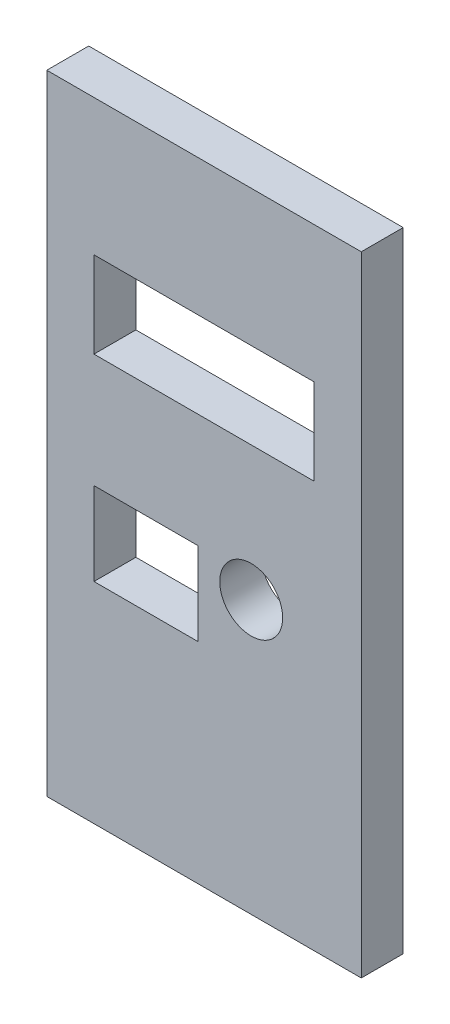
ISO-10303-21;
HEADER;
FILE_DESCRIPTION(('STEP AP214'),'2;1');
FILE_NAME('part.step','',(''),(''),'','','');
FILE_SCHEMA(('AUTOMOTIVE_DESIGN { 1 0 10303 214 1 1 1 1 }'));
ENDSEC;
DATA;
#1=APPLICATION_CONTEXT('core data for automotive mechanical design processes');
#2=APPLICATION_PROTOCOL_DEFINITION('international standard','automotive_design',2000,#1);
#3=PRODUCT_CONTEXT('',#1,'mechanical');
#4=PRODUCT('Part','Part','',(#3));
#5=PRODUCT_RELATED_PRODUCT_CATEGORY('part','',(#4));
#6=PRODUCT_DEFINITION_FORMATION('','',#4);
#7=PRODUCT_DEFINITION_CONTEXT('part definition',#1,'design');
#8=PRODUCT_DEFINITION('design','',#6,#7);
#9=PRODUCT_DEFINITION_SHAPE('','',#8);
#10=(LENGTH_UNIT() NAMED_UNIT(*) SI_UNIT(.MILLI.,.METRE.));
#11=(NAMED_UNIT(*) PLANE_ANGLE_UNIT() SI_UNIT($,.RADIAN.));
#12=(NAMED_UNIT(*) SI_UNIT($,.STERADIAN.) SOLID_ANGLE_UNIT());
#13=UNCERTAINTY_MEASURE_WITH_UNIT(LENGTH_MEASURE(1.E-05),#10,'distance_accuracy_value','');
#14=(GEOMETRIC_REPRESENTATION_CONTEXT(3) GLOBAL_UNCERTAINTY_ASSIGNED_CONTEXT((#13)) GLOBAL_UNIT_ASSIGNED_CONTEXT((#10,
#11,#12)) REPRESENTATION_CONTEXT('',''));
#15=CARTESIAN_POINT('',(0.,0.,0.));
#16=DIRECTION('',(0.,0.,1.));
#17=DIRECTION('',(1.,0.,0.));
#18=AXIS2_PLACEMENT_3D('',#15,#16,#17);
#19=CARTESIAN_POINT('',(0.,0.,2.));
#20=DIRECTION('',(0.,0.,1.));
#21=DIRECTION('',(1.,0.,0.));
#22=AXIS2_PLACEMENT_3D('',#19,#20,#21);
#23=PLANE('',#22);
#24=CARTESIAN_POINT('',(2.25,-2.,2.));
#25=DIRECTION('',(0.,0.,1.));
#26=DIRECTION('',(1.,0.,0.));
#27=AXIS2_PLACEMENT_3D('',#24,#25,#26);
#28=CIRCLE('',#27,1.5);
#29=CARTESIAN_POINT('',(3.75,-2.,2.));
#30=VERTEX_POINT('',#29);
#31=EDGE_CURVE('E223',#30,#30,#28,.T.);
#32=ORIENTED_EDGE('',*,*,#31,.F.);
#33=EDGE_LOOP('',(#32));
#34=FACE_BOUND('',#33,.T.);
#35=DIRECTION('',(0.,1.,0.));
#36=VECTOR('',#35,1.);
#37=CARTESIAN_POINT('',(-0.296198575968552,0.,2.));
#38=LINE('',#37,#36);
#39=CARTESIAN_POINT('',(-0.296198575968552,-4.99598046327325,2.));
#40=VERTEX_POINT('',#39);
#41=CARTESIAN_POINT('',(-0.296198575968552,-1.03441005186715,2.));
#42=VERTEX_POINT('',#41);
#43=EDGE_CURVE('E49',#40,#42,#38,.T.);
#44=ORIENTED_EDGE('',*,*,#43,.F.);
#45=DIRECTION('',(-1.,0.,0.));
#46=VECTOR('',#45,1.);
#47=CARTESIAN_POINT('',(0.,-4.99598046327325,2.));
#48=LINE('',#47,#46);
#49=CARTESIAN_POINT('',(-5.25,-4.99598046327325,2.));
#50=VERTEX_POINT('',#49);
#51=EDGE_CURVE('E141',#40,#50,#48,.T.);
#52=ORIENTED_EDGE('',*,*,#51,.T.);
#53=DIRECTION('',(0.,1.,0.));
#54=VECTOR('',#53,1.);
#55=CARTESIAN_POINT('',(-5.25,0.,2.));
#56=LINE('',#55,#54);
#57=CARTESIAN_POINT('',(-5.25,-1.03441005186715,2.));
#58=VERTEX_POINT('',#57);
#59=EDGE_CURVE('E126',#50,#58,#56,.T.);
#60=ORIENTED_EDGE('',*,*,#59,.T.);
#61=DIRECTION('',(-1.,0.,0.));
#62=VECTOR('',#61,1.);
#63=CARTESIAN_POINT('',(0.,-1.03441005186715,2.));
#64=LINE('',#63,#62);
#65=EDGE_CURVE('E135',#42,#58,#64,.T.);
#66=ORIENTED_EDGE('',*,*,#65,.F.);
#67=EDGE_LOOP('',(#44,#52,#60,#66));
#68=FACE_BOUND('',#67,.T.);
#69=DIRECTION('',(0.,-1.,0.));
#70=VECTOR('',#69,1.);
#71=CARTESIAN_POINT('',(-7.5,-15.,2.));
#72=LINE('',#71,#70);
#73=CARTESIAN_POINT('',(-7.5,15.,2.));
#74=VERTEX_POINT('',#73);
#75=CARTESIAN_POINT('',(-7.5,-15.,2.));
#76=VERTEX_POINT('',#75);
#77=EDGE_CURVE('E172',#74,#76,#72,.T.);
#78=ORIENTED_EDGE('',*,*,#77,.T.);
#79=DIRECTION('',(1.,0.,0.));
#80=VECTOR('',#79,1.);
#81=CARTESIAN_POINT('',(7.5,-15.,2.));
#82=LINE('',#81,#80);
#83=CARTESIAN_POINT('',(7.5,-15.,2.));
#84=VERTEX_POINT('',#83);
#85=EDGE_CURVE('E175',#76,#84,#82,.T.);
#86=ORIENTED_EDGE('',*,*,#85,.T.);
#87=DIRECTION('',(0.,1.,0.));
#88=VECTOR('',#87,1.);
#89=CARTESIAN_POINT('',(7.5,-15.,2.));
#90=LINE('',#89,#88);
#91=CARTESIAN_POINT('',(7.5,15.,2.));
#92=VERTEX_POINT('',#91);
#93=EDGE_CURVE('E178',#84,#92,#90,.T.);
#94=ORIENTED_EDGE('',*,*,#93,.T.);
#95=DIRECTION('',(-1.,0.,0.));
#96=VECTOR('',#95,1.);
#97=CARTESIAN_POINT('',(7.5,15.,2.));
#98=LINE('',#97,#96);
#99=EDGE_CURVE('E180',#92,#74,#98,.T.);
#100=ORIENTED_EDGE('',*,*,#99,.T.);
#101=EDGE_LOOP('',(#78,#86,#94,#100));
#102=FACE_BOUND('',#101,.T.);
#103=DIRECTION('',(0.,1.,0.));
#104=VECTOR('',#103,1.);
#105=CARTESIAN_POINT('',(5.25,0.,2.));
#106=LINE('',#105,#104);
#107=CARTESIAN_POINT('',(5.25,4.39711256157767,2.));
#108=VERTEX_POINT('',#107);
#109=CARTESIAN_POINT('',(5.25,8.5,2.));
#110=VERTEX_POINT('',#109);
#111=EDGE_CURVE('E153',#108,#110,#106,.T.);
#112=ORIENTED_EDGE('',*,*,#111,.F.);
#113=DIRECTION('',(-1.,0.,0.));
#114=VECTOR('',#113,1.);
#115=CARTESIAN_POINT('',(0.,4.39711256157767,2.));
#116=LINE('',#115,#114);
#117=CARTESIAN_POINT('',(-5.25,4.39711256157767,2.));
#118=VERTEX_POINT('',#117);
#119=EDGE_CURVE('E148',#108,#118,#116,.T.);
#120=ORIENTED_EDGE('',*,*,#119,.T.);
#121=DIRECTION('',(0.,1.,0.));
#122=VECTOR('',#121,1.);
#123=CARTESIAN_POINT('',(-5.25,0.,2.));
#124=LINE('',#123,#122);
#125=CARTESIAN_POINT('',(-5.25,8.5,2.));
#126=VERTEX_POINT('',#125);
#127=EDGE_CURVE('E159',#118,#126,#124,.T.);
#128=ORIENTED_EDGE('',*,*,#127,.T.);
#129=DIRECTION('',(-1.,0.,0.));
#130=VECTOR('',#129,1.);
#131=CARTESIAN_POINT('',(0.,8.5,2.));
#132=LINE('',#131,#130);
#133=EDGE_CURVE('E156',#110,#126,#132,.T.);
#134=ORIENTED_EDGE('',*,*,#133,.F.);
#135=EDGE_LOOP('',(#112,#120,#128,#134));
#136=FACE_BOUND('',#135,.T.);
#137=ADVANCED_FACE('F33',(#34,#68,#102,#136),#23,.T.);
#138=CARTESIAN_POINT('',(0.,0.,0.));
#139=DIRECTION('',(0.,0.,1.));
#140=DIRECTION('',(1.,0.,0.));
#141=AXIS2_PLACEMENT_3D('',#138,#139,#140);
#142=PLANE('',#141);
#143=CARTESIAN_POINT('',(2.25,-2.,0.));
#144=DIRECTION('',(0.,0.,1.));
#145=DIRECTION('',(1.,0.,0.));
#146=AXIS2_PLACEMENT_3D('',#143,#144,#145);
#147=CIRCLE('',#146,1.5);
#148=CARTESIAN_POINT('',(3.75,-2.,0.));
#149=VERTEX_POINT('',#148);
#150=EDGE_CURVE('E37',#149,#149,#147,.T.);
#151=ORIENTED_EDGE('',*,*,#150,.T.);
#152=EDGE_LOOP('',(#151));
#153=FACE_BOUND('',#152,.T.);
#154=DIRECTION('',(-1.,0.,0.));
#155=VECTOR('',#154,1.);
#156=CARTESIAN_POINT('',(0.,-4.99598046327325,0.));
#157=LINE('',#156,#155);
#158=CARTESIAN_POINT('',(-0.296198575968552,-4.99598046327325,0.));
#159=VERTEX_POINT('',#158);
#160=CARTESIAN_POINT('',(-5.25,-4.99598046327325,0.));
#161=VERTEX_POINT('',#160);
#162=EDGE_CURVE('E42',#159,#161,#157,.T.);
#163=ORIENTED_EDGE('',*,*,#162,.F.);
#164=DIRECTION('',(0.,1.,0.));
#165=VECTOR('',#164,1.);
#166=CARTESIAN_POINT('',(-0.296198575968552,0.,0.));
#167=LINE('',#166,#165);
#168=CARTESIAN_POINT('',(-0.296198575968552,-1.03441005186715,0.));
#169=VERTEX_POINT('',#168);
#170=EDGE_CURVE('E11',#159,#169,#167,.T.);
#171=ORIENTED_EDGE('',*,*,#170,.T.);
#172=DIRECTION('',(-1.,0.,0.));
#173=VECTOR('',#172,1.);
#174=CARTESIAN_POINT('',(0.,-1.03441005186715,0.));
#175=LINE('',#174,#173);
#176=CARTESIAN_POINT('',(-5.25,-1.03441005186715,0.));
#177=VERTEX_POINT('',#176);
#178=EDGE_CURVE('E211',#169,#177,#175,.T.);
#179=ORIENTED_EDGE('',*,*,#178,.T.);
#180=DIRECTION('',(0.,1.,0.));
#181=VECTOR('',#180,1.);
#182=CARTESIAN_POINT('',(-5.25,0.,0.));
#183=LINE('',#182,#181);
#184=EDGE_CURVE('E129',#161,#177,#183,.T.);
#185=ORIENTED_EDGE('',*,*,#184,.F.);
#186=EDGE_LOOP('',(#163,#171,#179,#185));
#187=FACE_BOUND('',#186,.T.);
#188=DIRECTION('',(0.,-1.,0.));
#189=VECTOR('',#188,1.);
#190=CARTESIAN_POINT('',(-7.5,-15.,0.));
#191=LINE('',#190,#189);
#192=CARTESIAN_POINT('',(-7.5,15.,0.));
#193=VERTEX_POINT('',#192);
#194=CARTESIAN_POINT('',(-7.5,-15.,0.));
#195=VERTEX_POINT('',#194);
#196=EDGE_CURVE('E165',#193,#195,#191,.T.);
#197=ORIENTED_EDGE('',*,*,#196,.F.);
#198=DIRECTION('',(-1.,0.,0.));
#199=VECTOR('',#198,1.);
#200=CARTESIAN_POINT('',(7.5,15.,0.));
#201=LINE('',#200,#199);
#202=CARTESIAN_POINT('',(7.5,15.,0.));
#203=VERTEX_POINT('',#202);
#204=EDGE_CURVE('E176',#203,#193,#201,.T.);
#205=ORIENTED_EDGE('',*,*,#204,.F.);
#206=DIRECTION('',(0.,1.,0.));
#207=VECTOR('',#206,1.);
#208=CARTESIAN_POINT('',(7.5,-15.,0.));
#209=LINE('',#208,#207);
#210=CARTESIAN_POINT('',(7.5,-15.,0.));
#211=VERTEX_POINT('',#210);
#212=EDGE_CURVE('E187',#211,#203,#209,.T.);
#213=ORIENTED_EDGE('',*,*,#212,.F.);
#214=DIRECTION('',(1.,0.,0.));
#215=VECTOR('',#214,1.);
#216=CARTESIAN_POINT('',(7.5,-15.,0.));
#217=LINE('',#216,#215);
#218=EDGE_CURVE('E185',#195,#211,#217,.T.);
#219=ORIENTED_EDGE('',*,*,#218,.F.);
#220=EDGE_LOOP('',(#197,#205,#213,#219));
#221=FACE_BOUND('',#220,.T.);
#222=DIRECTION('',(-1.,0.,0.));
#223=VECTOR('',#222,1.);
#224=CARTESIAN_POINT('',(0.,4.39711256157767,0.));
#225=LINE('',#224,#223);
#226=CARTESIAN_POINT('',(5.25,4.39711256157767,0.));
#227=VERTEX_POINT('',#226);
#228=CARTESIAN_POINT('',(-5.25,4.39711256157767,0.));
#229=VERTEX_POINT('',#228);
#230=EDGE_CURVE('E209',#227,#229,#225,.T.);
#231=ORIENTED_EDGE('',*,*,#230,.F.);
#232=DIRECTION('',(0.,1.,0.));
#233=VECTOR('',#232,1.);
#234=CARTESIAN_POINT('',(5.25,0.,0.));
#235=LINE('',#234,#233);
#236=CARTESIAN_POINT('',(5.25,8.5,0.));
#237=VERTEX_POINT('',#236);
#238=EDGE_CURVE('E201',#227,#237,#235,.T.);
#239=ORIENTED_EDGE('',*,*,#238,.T.);
#240=DIRECTION('',(-1.,0.,0.));
#241=VECTOR('',#240,1.);
#242=CARTESIAN_POINT('',(0.,8.5,0.));
#243=LINE('',#242,#241);
#244=CARTESIAN_POINT('',(-5.25,8.5,0.));
#245=VERTEX_POINT('',#244);
#246=EDGE_CURVE('E204',#237,#245,#243,.T.);
#247=ORIENTED_EDGE('',*,*,#246,.T.);
#248=DIRECTION('',(0.,1.,0.));
#249=VECTOR('',#248,1.);
#250=CARTESIAN_POINT('',(-5.25,0.,0.));
#251=LINE('',#250,#249);
#252=EDGE_CURVE('E207',#229,#245,#251,.T.);
#253=ORIENTED_EDGE('',*,*,#252,.F.);
#254=EDGE_LOOP('',(#231,#239,#247,#253));
#255=FACE_BOUND('',#254,.T.);
#256=ADVANCED_FACE('F219',(#153,#187,#221,#255),#142,.F.);
#257=CARTESIAN_POINT('',(-7.5,-15.,2.));
#258=DIRECTION('',(1.,0.,0.));
#259=DIRECTION('',(0.,1.,0.));
#260=AXIS2_PLACEMENT_3D('',#257,#258,#259);
#261=PLANE('',#260);
#262=ORIENTED_EDGE('',*,*,#196,.T.);
#263=DIRECTION('',(0.,0.,-1.));
#264=VECTOR('',#263,1.);
#265=CARTESIAN_POINT('',(-7.5,-15.,2.));
#266=LINE('',#265,#264);
#267=EDGE_CURVE('E198',#76,#195,#266,.T.);
#268=ORIENTED_EDGE('',*,*,#267,.F.);
#269=ORIENTED_EDGE('',*,*,#77,.F.);
#270=DIRECTION('',(0.,0.,-1.));
#271=VECTOR('',#270,1.);
#272=CARTESIAN_POINT('',(-7.5,15.,2.));
#273=LINE('',#272,#271);
#274=EDGE_CURVE('E182',#74,#193,#273,.T.);
#275=ORIENTED_EDGE('',*,*,#274,.T.);
#276=EDGE_LOOP('',(#262,#268,#269,#275));
#277=FACE_BOUND('',#276,.T.);
#278=ADVANCED_FACE('F35',(#277),#261,.F.);
#279=CARTESIAN_POINT('',(7.5,-15.,2.));
#280=DIRECTION('',(0.,1.,0.));
#281=DIRECTION('',(-1.,0.,0.));
#282=AXIS2_PLACEMENT_3D('',#279,#280,#281);
#283=PLANE('',#282);
#284=ORIENTED_EDGE('',*,*,#218,.T.);
#285=DIRECTION('',(0.,0.,-1.));
#286=VECTOR('',#285,1.);
#287=CARTESIAN_POINT('',(7.5,-15.,2.));
#288=LINE('',#287,#286);
#289=EDGE_CURVE('E195',#84,#211,#288,.T.);
#290=ORIENTED_EDGE('',*,*,#289,.F.);
#291=ORIENTED_EDGE('',*,*,#85,.F.);
#292=ORIENTED_EDGE('',*,*,#267,.T.);
#293=EDGE_LOOP('',(#284,#290,#291,#292));
#294=FACE_BOUND('',#293,.T.);
#295=ADVANCED_FACE('F249',(#294),#283,.F.);
#296=CARTESIAN_POINT('',(7.5,-15.,2.));
#297=DIRECTION('',(-1.,0.,0.));
#298=DIRECTION('',(0.,0.,1.));
#299=AXIS2_PLACEMENT_3D('',#296,#297,#298);
#300=PLANE('',#299);
#301=ORIENTED_EDGE('',*,*,#212,.T.);
#302=DIRECTION('',(0.,0.,-1.));
#303=VECTOR('',#302,1.);
#304=CARTESIAN_POINT('',(7.5,15.,2.));
#305=LINE('',#304,#303);
#306=EDGE_CURVE('E192',#92,#203,#305,.T.);
#307=ORIENTED_EDGE('',*,*,#306,.F.);
#308=ORIENTED_EDGE('',*,*,#93,.F.);
#309=ORIENTED_EDGE('',*,*,#289,.T.);
#310=EDGE_LOOP('',(#301,#307,#308,#309));
#311=FACE_BOUND('',#310,.T.);
#312=ADVANCED_FACE('F246',(#311),#300,.F.);
#313=CARTESIAN_POINT('',(7.5,15.,2.));
#314=DIRECTION('',(0.,-1.,0.));
#315=DIRECTION('',(0.,0.,-1.));
#316=AXIS2_PLACEMENT_3D('',#313,#314,#315);
#317=PLANE('',#316);
#318=ORIENTED_EDGE('',*,*,#204,.T.);
#319=ORIENTED_EDGE('',*,*,#274,.F.);
#320=ORIENTED_EDGE('',*,*,#99,.F.);
#321=ORIENTED_EDGE('',*,*,#306,.T.);
#322=EDGE_LOOP('',(#318,#319,#320,#321));
#323=FACE_BOUND('',#322,.T.);
#324=ADVANCED_FACE('F243',(#323),#317,.F.);
#325=CARTESIAN_POINT('',(0.,4.39711256157767,-8.));
#326=DIRECTION('',(0.,1.,0.));
#327=DIRECTION('',(0.,0.,1.));
#328=AXIS2_PLACEMENT_3D('',#325,#326,#327);
#329=PLANE('',#328);
#330=ORIENTED_EDGE('',*,*,#230,.T.);
#331=DIRECTION('',(0.,0.,1.));
#332=VECTOR('',#331,1.);
#333=CARTESIAN_POINT('',(-5.25,4.39711256157767,-8.));
#334=LINE('',#333,#332);
#335=EDGE_CURVE('E163',#229,#118,#334,.T.);
#336=ORIENTED_EDGE('',*,*,#335,.T.);
#337=ORIENTED_EDGE('',*,*,#119,.F.);
#338=DIRECTION('',(0.,0.,1.));
#339=VECTOR('',#338,1.);
#340=CARTESIAN_POINT('',(5.25,4.39711256157767,-8.));
#341=LINE('',#340,#339);
#342=EDGE_CURVE('E162',#227,#108,#341,.T.);
#343=ORIENTED_EDGE('',*,*,#342,.F.);
#344=EDGE_LOOP('',(#330,#336,#337,#343));
#345=FACE_BOUND('',#344,.T.);
#346=ADVANCED_FACE('F240',(#345),#329,.T.);
#347=CARTESIAN_POINT('',(-5.25,0.,-8.));
#348=DIRECTION('',(1.,0.,0.));
#349=DIRECTION('',(0.,0.,-1.));
#350=AXIS2_PLACEMENT_3D('',#347,#348,#349);
#351=PLANE('',#350);
#352=ORIENTED_EDGE('',*,*,#252,.T.);
#353=DIRECTION('',(0.,0.,1.));
#354=VECTOR('',#353,1.);
#355=CARTESIAN_POINT('',(-5.25,8.5,-8.));
#356=LINE('',#355,#354);
#357=EDGE_CURVE('E166',#245,#126,#356,.T.);
#358=ORIENTED_EDGE('',*,*,#357,.T.);
#359=ORIENTED_EDGE('',*,*,#127,.F.);
#360=ORIENTED_EDGE('',*,*,#335,.F.);
#361=EDGE_LOOP('',(#352,#358,#359,#360));
#362=FACE_BOUND('',#361,.T.);
#363=ADVANCED_FACE('F281',(#362),#351,.T.);
#364=CARTESIAN_POINT('',(0.,8.5,-8.));
#365=DIRECTION('',(0.,1.,0.));
#366=DIRECTION('',(0.,0.,1.));
#367=AXIS2_PLACEMENT_3D('',#364,#365,#366);
#368=PLANE('',#367);
#369=DIRECTION('',(0.,0.,1.));
#370=VECTOR('',#369,1.);
#371=CARTESIAN_POINT('',(5.25,8.5,-8.));
#372=LINE('',#371,#370);
#373=EDGE_CURVE('E168',#237,#110,#372,.T.);
#374=ORIENTED_EDGE('',*,*,#373,.T.);
#375=ORIENTED_EDGE('',*,*,#133,.T.);
#376=ORIENTED_EDGE('',*,*,#357,.F.);
#377=ORIENTED_EDGE('',*,*,#246,.F.);
#378=EDGE_LOOP('',(#374,#375,#376,#377));
#379=FACE_BOUND('',#378,.T.);
#380=ADVANCED_FACE('F284',(#379),#368,.F.);
#381=CARTESIAN_POINT('',(5.25,0.,-8.));
#382=DIRECTION('',(1.,0.,0.));
#383=DIRECTION('',(0.,0.,-1.));
#384=AXIS2_PLACEMENT_3D('',#381,#382,#383);
#385=PLANE('',#384);
#386=ORIENTED_EDGE('',*,*,#342,.T.);
#387=ORIENTED_EDGE('',*,*,#111,.T.);
#388=ORIENTED_EDGE('',*,*,#373,.F.);
#389=ORIENTED_EDGE('',*,*,#238,.F.);
#390=EDGE_LOOP('',(#386,#387,#388,#389));
#391=FACE_BOUND('',#390,.T.);
#392=ADVANCED_FACE('F272',(#391),#385,.F.);
#393=CARTESIAN_POINT('',(-0.296198575968552,0.,-8.));
#394=DIRECTION('',(1.,0.,0.));
#395=DIRECTION('',(0.,0.,-1.));
#396=AXIS2_PLACEMENT_3D('',#393,#394,#395);
#397=PLANE('',#396);
#398=DIRECTION('',(0.,0.,1.));
#399=VECTOR('',#398,1.);
#400=CARTESIAN_POINT('',(-0.296198575968552,-4.99598046327325,-8.));
#401=LINE('',#400,#399);
#402=EDGE_CURVE('E146',#159,#40,#401,.T.);
#403=ORIENTED_EDGE('',*,*,#402,.T.);
#404=ORIENTED_EDGE('',*,*,#43,.T.);
#405=DIRECTION('',(0.,0.,1.));
#406=VECTOR('',#405,1.);
#407=CARTESIAN_POINT('',(-0.296198575968552,-1.03441005186715,-8.));
#408=LINE('',#407,#406);
#409=EDGE_CURVE('E132',#169,#42,#408,.T.);
#410=ORIENTED_EDGE('',*,*,#409,.F.);
#411=ORIENTED_EDGE('',*,*,#170,.F.);
#412=EDGE_LOOP('',(#403,#404,#410,#411));
#413=FACE_BOUND('',#412,.T.);
#414=ADVANCED_FACE('F221',(#413),#397,.F.);
#415=CARTESIAN_POINT('',(0.,-4.99598046327325,-8.));
#416=DIRECTION('',(0.,1.,0.));
#417=DIRECTION('',(0.,0.,1.));
#418=AXIS2_PLACEMENT_3D('',#415,#416,#417);
#419=PLANE('',#418);
#420=ORIENTED_EDGE('',*,*,#162,.T.);
#421=DIRECTION('',(0.,0.,1.));
#422=VECTOR('',#421,1.);
#423=CARTESIAN_POINT('',(-5.25,-4.99598046327325,-8.));
#424=LINE('',#423,#422);
#425=EDGE_CURVE('E131',#161,#50,#424,.T.);
#426=ORIENTED_EDGE('',*,*,#425,.T.);
#427=ORIENTED_EDGE('',*,*,#51,.F.);
#428=ORIENTED_EDGE('',*,*,#402,.F.);
#429=EDGE_LOOP('',(#420,#426,#427,#428));
#430=FACE_BOUND('',#429,.T.);
#431=ADVANCED_FACE('F217',(#430),#419,.T.);
#432=CARTESIAN_POINT('',(-5.25,0.,-8.));
#433=DIRECTION('',(1.,0.,0.));
#434=DIRECTION('',(0.,0.,-1.));
#435=AXIS2_PLACEMENT_3D('',#432,#433,#434);
#436=PLANE('',#435);
#437=ORIENTED_EDGE('',*,*,#184,.T.);
#438=DIRECTION('',(0.,0.,1.));
#439=VECTOR('',#438,1.);
#440=CARTESIAN_POINT('',(-5.25,-1.03441005186715,-8.));
#441=LINE('',#440,#439);
#442=EDGE_CURVE('E57',#177,#58,#441,.T.);
#443=ORIENTED_EDGE('',*,*,#442,.T.);
#444=ORIENTED_EDGE('',*,*,#59,.F.);
#445=ORIENTED_EDGE('',*,*,#425,.F.);
#446=EDGE_LOOP('',(#437,#443,#444,#445));
#447=FACE_BOUND('',#446,.T.);
#448=ADVANCED_FACE('F123',(#447),#436,.T.);
#449=CARTESIAN_POINT('',(0.,-1.03441005186715,-8.));
#450=DIRECTION('',(0.,1.,0.));
#451=DIRECTION('',(0.,0.,1.));
#452=AXIS2_PLACEMENT_3D('',#449,#450,#451);
#453=PLANE('',#452);
#454=ORIENTED_EDGE('',*,*,#409,.T.);
#455=ORIENTED_EDGE('',*,*,#65,.T.);
#456=ORIENTED_EDGE('',*,*,#442,.F.);
#457=ORIENTED_EDGE('',*,*,#178,.F.);
#458=EDGE_LOOP('',(#454,#455,#456,#457));
#459=FACE_BOUND('',#458,.T.);
#460=ADVANCED_FACE('F136',(#459),#453,.F.);
#461=CARTESIAN_POINT('',(2.25,-2.,-8.));
#462=DIRECTION('',(0.,0.,1.));
#463=DIRECTION('',(1.,0.,0.));
#464=AXIS2_PLACEMENT_3D('',#461,#462,#463);
#465=CYLINDRICAL_SURFACE('',#464,1.5);
#466=ORIENTED_EDGE('',*,*,#31,.T.);
#467=EDGE_LOOP('',(#466));
#468=FACE_BOUND('',#467,.T.);
#469=ORIENTED_EDGE('',*,*,#150,.F.);
#470=EDGE_LOOP('',(#469));
#471=FACE_BOUND('',#470,.T.);
#472=ADVANCED_FACE('F228',(#468,#471),#465,.F.);
#473=CLOSED_SHELL('',(#137,#256,#278,#295,#312,#324,#346,#363,#380,#392,#414,#431,#448,#460,#472));
#474=MANIFOLD_SOLID_BREP('B2',#473);
#475=ADVANCED_BREP_SHAPE_REPRESENTATION('',(#18,#474),#14);
#476=SHAPE_DEFINITION_REPRESENTATION(#9,#475);
ENDSEC;
END-ISO-10303-21;
